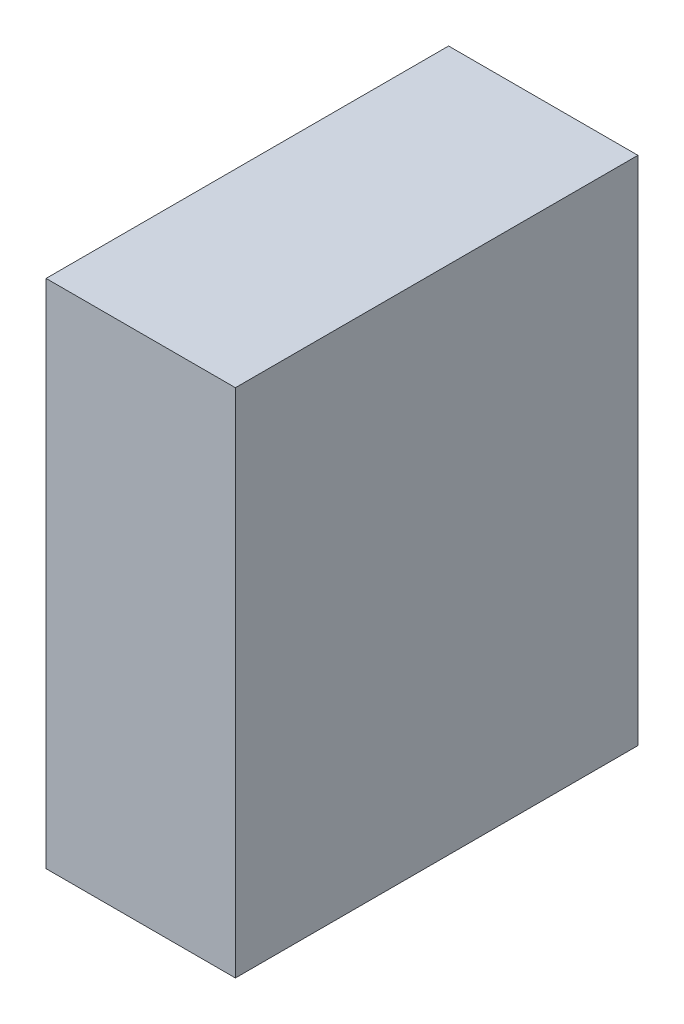
ISO-10303-21;
HEADER;
FILE_DESCRIPTION(('STEP AP214'),'2;1');
FILE_NAME('part.step','',(''),(''),'','','');
FILE_SCHEMA(('AUTOMOTIVE_DESIGN { 1 0 10303 214 1 1 1 1 }'));
ENDSEC;
DATA;
#1=APPLICATION_CONTEXT('core data for automotive mechanical design processes');
#2=APPLICATION_PROTOCOL_DEFINITION('international standard','automotive_design',2000,#1);
#3=PRODUCT_CONTEXT('',#1,'mechanical');
#4=PRODUCT('Part','Part','',(#3));
#5=PRODUCT_RELATED_PRODUCT_CATEGORY('part','',(#4));
#6=PRODUCT_DEFINITION_FORMATION('','',#4);
#7=PRODUCT_DEFINITION_CONTEXT('part definition',#1,'design');
#8=PRODUCT_DEFINITION('design','',#6,#7);
#9=PRODUCT_DEFINITION_SHAPE('','',#8);
#10=(LENGTH_UNIT() NAMED_UNIT(*) SI_UNIT(.MILLI.,.METRE.));
#11=(NAMED_UNIT(*) PLANE_ANGLE_UNIT() SI_UNIT($,.RADIAN.));
#12=(NAMED_UNIT(*) SI_UNIT($,.STERADIAN.) SOLID_ANGLE_UNIT());
#13=UNCERTAINTY_MEASURE_WITH_UNIT(LENGTH_MEASURE(1.E-05),#10,'distance_accuracy_value','');
#14=(GEOMETRIC_REPRESENTATION_CONTEXT(3) GLOBAL_UNCERTAINTY_ASSIGNED_CONTEXT((#13)) GLOBAL_UNIT_ASSIGNED_CONTEXT((#10,
#11,#12)) REPRESENTATION_CONTEXT('',''));
#15=CARTESIAN_POINT('',(0.,0.,0.));
#16=DIRECTION('',(0.,0.,1.));
#17=DIRECTION('',(1.,0.,0.));
#18=AXIS2_PLACEMENT_3D('',#15,#16,#17);
#19=CARTESIAN_POINT('',(-0.25868884,-0.6985,0.));
#20=DIRECTION('',(-1.,0.,0.));
#21=DIRECTION('',(0.,0.,1.));
#22=AXIS2_PLACEMENT_3D('',#19,#20,#21);
#23=PLANE('',#22);
#24=DIRECTION('',(0.,0.,1.));
#25=VECTOR('',#24,1.);
#26=CARTESIAN_POINT('',(-0.25868884,0.6985,0.));
#27=LINE('',#26,#25);
#28=CARTESIAN_POINT('',(-0.25868884,0.6985,0.));
#29=VERTEX_POINT('',#28);
#30=CARTESIAN_POINT('',(-0.25868884,0.6985,1.0999978));
#31=VERTEX_POINT('',#30);
#32=EDGE_CURVE('E20',#29,#31,#27,.T.);
#33=ORIENTED_EDGE('',*,*,#32,.F.);
#34=DIRECTION('',(0.,1.,0.));
#35=VECTOR('',#34,1.);
#36=CARTESIAN_POINT('',(-0.25868884,0.6985,0.));
#37=LINE('',#36,#35);
#38=CARTESIAN_POINT('',(-0.25868884,-0.6985,0.));
#39=VERTEX_POINT('',#38);
#40=EDGE_CURVE('E80',#29,#39,#37,.F.);
#41=ORIENTED_EDGE('',*,*,#40,.T.);
#42=DIRECTION('',(0.,0.,-1.));
#43=VECTOR('',#42,1.);
#44=CARTESIAN_POINT('',(-0.25868884,-0.6985,0.));
#45=LINE('',#44,#43);
#46=CARTESIAN_POINT('',(-0.25868884,-0.6985,1.0999978));
#47=VERTEX_POINT('',#46);
#48=EDGE_CURVE('E68',#47,#39,#45,.T.);
#49=ORIENTED_EDGE('',*,*,#48,.F.);
#50=DIRECTION('',(0.,1.,0.));
#51=VECTOR('',#50,1.);
#52=CARTESIAN_POINT('',(-0.25868884,0.6985,1.0999978));
#53=LINE('',#52,#51);
#54=EDGE_CURVE('E56',#31,#47,#53,.F.);
#55=ORIENTED_EDGE('',*,*,#54,.F.);
#56=EDGE_LOOP('',(#33,#41,#49,#55));
#57=FACE_BOUND('',#56,.T.);
#58=ADVANCED_FACE('F17',(#57),#23,.T.);
#59=CARTESIAN_POINT('',(-0.25868884,0.6985,0.));
#60=DIRECTION('',(0.,1.,0.));
#61=DIRECTION('',(0.,0.,1.));
#62=AXIS2_PLACEMENT_3D('',#59,#60,#61);
#63=PLANE('',#62);
#64=DIRECTION('',(0.,0.,-1.));
#65=VECTOR('',#64,1.);
#66=CARTESIAN_POINT('',(0.25869138,0.6985,0.));
#67=LINE('',#66,#65);
#68=CARTESIAN_POINT('',(0.25869138,0.6985,0.));
#69=VERTEX_POINT('',#68);
#70=CARTESIAN_POINT('',(0.25869138,0.6985,1.0999978));
#71=VERTEX_POINT('',#70);
#72=EDGE_CURVE('E83',#69,#71,#67,.F.);
#73=ORIENTED_EDGE('',*,*,#72,.F.);
#74=DIRECTION('',(1.,0.,0.));
#75=VECTOR('',#74,1.);
#76=CARTESIAN_POINT('',(0.25869138,0.6985,0.));
#77=LINE('',#76,#75);
#78=EDGE_CURVE('E65',#69,#29,#77,.F.);
#79=ORIENTED_EDGE('',*,*,#78,.T.);
#80=ORIENTED_EDGE('',*,*,#32,.T.);
#81=DIRECTION('',(1.,0.,0.));
#82=VECTOR('',#81,1.);
#83=CARTESIAN_POINT('',(0.25869138,0.6985,1.0999978));
#84=LINE('',#83,#82);
#85=EDGE_CURVE('E62',#71,#31,#84,.F.);
#86=ORIENTED_EDGE('',*,*,#85,.F.);
#87=EDGE_LOOP('',(#73,#79,#80,#86));
#88=FACE_BOUND('',#87,.T.);
#89=ADVANCED_FACE('F61',(#88),#63,.T.);
#90=CARTESIAN_POINT('',(0.25869138,0.6985,1.0999978));
#91=DIRECTION('',(0.,0.,1.));
#92=DIRECTION('',(1.,0.,0.));
#93=AXIS2_PLACEMENT_3D('',#90,#91,#92);
#94=PLANE('',#93);
#95=DIRECTION('',(1.,0.,0.));
#96=VECTOR('',#95,1.);
#97=CARTESIAN_POINT('',(0.25869138,-0.6985,1.0999978));
#98=LINE('',#97,#96);
#99=CARTESIAN_POINT('',(0.25869138,-0.6985,1.0999978));
#100=VERTEX_POINT('',#99);
#101=EDGE_CURVE('E70',#100,#47,#98,.F.);
#102=ORIENTED_EDGE('',*,*,#101,.F.);
#103=DIRECTION('',(0.,1.,0.));
#104=VECTOR('',#103,1.);
#105=CARTESIAN_POINT('',(0.25869138,0.6985,1.0999978));
#106=LINE('',#105,#104);
#107=EDGE_CURVE('E74',#71,#100,#106,.F.);
#108=ORIENTED_EDGE('',*,*,#107,.F.);
#109=ORIENTED_EDGE('',*,*,#85,.T.);
#110=ORIENTED_EDGE('',*,*,#54,.T.);
#111=EDGE_LOOP('',(#102,#108,#109,#110));
#112=FACE_BOUND('',#111,.T.);
#113=ADVANCED_FACE('F72',(#112),#94,.T.);
#114=CARTESIAN_POINT('',(0.25869138,-0.6985,0.));
#115=DIRECTION('',(0.,-1.,0.));
#116=DIRECTION('',(0.,0.,-1.));
#117=AXIS2_PLACEMENT_3D('',#114,#115,#116);
#118=PLANE('',#117);
#119=ORIENTED_EDGE('',*,*,#48,.T.);
#120=DIRECTION('',(1.,0.,0.));
#121=VECTOR('',#120,1.);
#122=CARTESIAN_POINT('',(0.25869138,-0.6985,0.));
#123=LINE('',#122,#121);
#124=CARTESIAN_POINT('',(0.25869138,-0.6985,0.));
#125=VERTEX_POINT('',#124);
#126=EDGE_CURVE('E35',#39,#125,#123,.T.);
#127=ORIENTED_EDGE('',*,*,#126,.T.);
#128=DIRECTION('',(0.,0.,-1.));
#129=VECTOR('',#128,1.);
#130=CARTESIAN_POINT('',(0.25869138,-0.6985,0.));
#131=LINE('',#130,#129);
#132=EDGE_CURVE('E26',#100,#125,#131,.T.);
#133=ORIENTED_EDGE('',*,*,#132,.F.);
#134=ORIENTED_EDGE('',*,*,#101,.T.);
#135=EDGE_LOOP('',(#119,#127,#133,#134));
#136=FACE_BOUND('',#135,.T.);
#137=ADVANCED_FACE('F89',(#136),#118,.T.);
#138=CARTESIAN_POINT('',(0.25869138,0.6985,0.));
#139=DIRECTION('',(0.,0.,1.));
#140=DIRECTION('',(1.,0.,0.));
#141=AXIS2_PLACEMENT_3D('',#138,#139,#140);
#142=PLANE('',#141);
#143=ORIENTED_EDGE('',*,*,#126,.F.);
#144=ORIENTED_EDGE('',*,*,#40,.F.);
#145=ORIENTED_EDGE('',*,*,#78,.F.);
#146=DIRECTION('',(0.,1.,0.));
#147=VECTOR('',#146,1.);
#148=CARTESIAN_POINT('',(0.25869138,0.6985,0.));
#149=LINE('',#148,#147);
#150=EDGE_CURVE('E11',#125,#69,#149,.T.);
#151=ORIENTED_EDGE('',*,*,#150,.F.);
#152=EDGE_LOOP('',(#143,#144,#145,#151));
#153=FACE_BOUND('',#152,.T.);
#154=ADVANCED_FACE('F91',(#153),#142,.F.);
#155=CARTESIAN_POINT('',(0.25869138,0.6985,0.));
#156=DIRECTION('',(1.,0.,0.));
#157=DIRECTION('',(0.,0.,-1.));
#158=AXIS2_PLACEMENT_3D('',#155,#156,#157);
#159=PLANE('',#158);
#160=ORIENTED_EDGE('',*,*,#132,.T.);
#161=ORIENTED_EDGE('',*,*,#150,.T.);
#162=ORIENTED_EDGE('',*,*,#72,.T.);
#163=ORIENTED_EDGE('',*,*,#107,.T.);
#164=EDGE_LOOP('',(#160,#161,#162,#163));
#165=FACE_BOUND('',#164,.T.);
#166=ADVANCED_FACE('F88',(#165),#159,.T.);
#167=CLOSED_SHELL('',(#58,#89,#113,#137,#154,#166));
#168=MANIFOLD_SOLID_BREP('B1',#167);
#169=ADVANCED_BREP_SHAPE_REPRESENTATION('',(#18,#168),#14);
#170=SHAPE_DEFINITION_REPRESENTATION(#9,#169);
ENDSEC;
END-ISO-10303-21;
